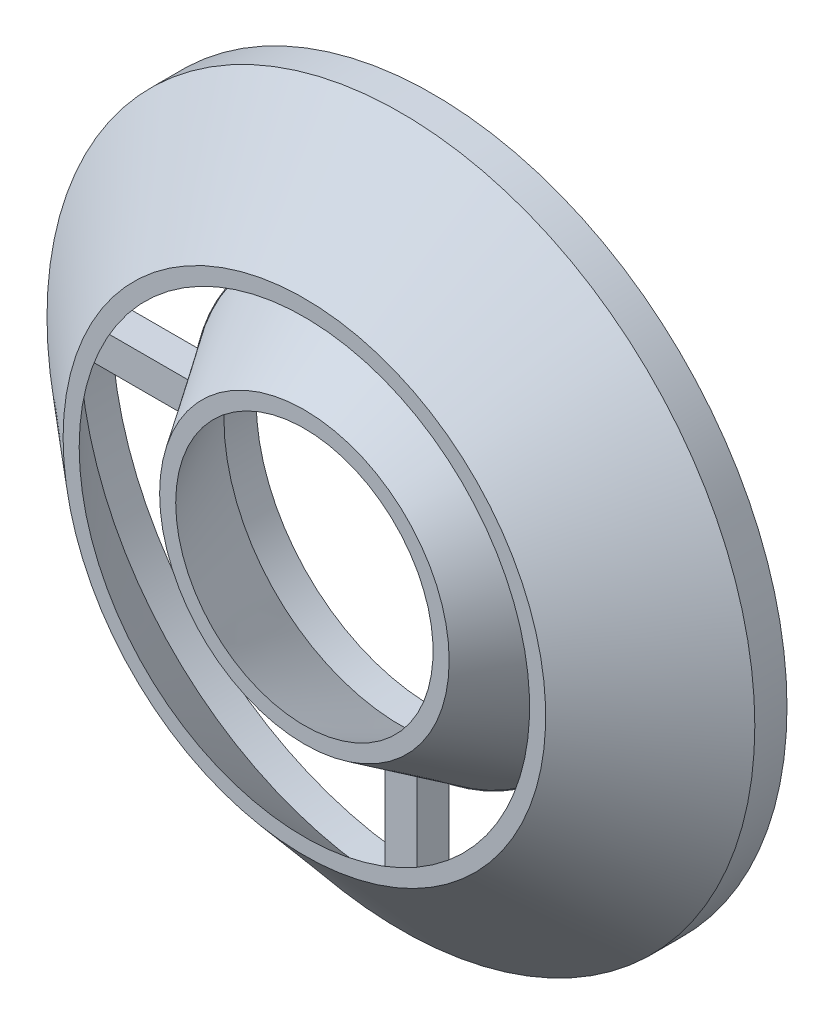
ISO-10303-21;
HEADER;
FILE_DESCRIPTION(('STEP AP214'),'2;1');
FILE_NAME('part.step','',(''),(''),'','','');
FILE_SCHEMA(('AUTOMOTIVE_DESIGN { 1 0 10303 214 1 1 1 1 }'));
ENDSEC;
DATA;
#1=APPLICATION_CONTEXT('core data for automotive mechanical design processes');
#2=APPLICATION_PROTOCOL_DEFINITION('international standard','automotive_design',2000,#1);
#3=PRODUCT_CONTEXT('',#1,'mechanical');
#4=PRODUCT('Part','Part','',(#3));
#5=PRODUCT_RELATED_PRODUCT_CATEGORY('part','',(#4));
#6=PRODUCT_DEFINITION_FORMATION('','',#4);
#7=PRODUCT_DEFINITION_CONTEXT('part definition',#1,'design');
#8=PRODUCT_DEFINITION('design','',#6,#7);
#9=PRODUCT_DEFINITION_SHAPE('','',#8);
#10=(LENGTH_UNIT() NAMED_UNIT(*) SI_UNIT(.MILLI.,.METRE.));
#11=(NAMED_UNIT(*) PLANE_ANGLE_UNIT() SI_UNIT($,.RADIAN.));
#12=(NAMED_UNIT(*) SI_UNIT($,.STERADIAN.) SOLID_ANGLE_UNIT());
#13=UNCERTAINTY_MEASURE_WITH_UNIT(LENGTH_MEASURE(1.E-05),#10,'distance_accuracy_value','');
#14=(GEOMETRIC_REPRESENTATION_CONTEXT(3) GLOBAL_UNCERTAINTY_ASSIGNED_CONTEXT((#13)) GLOBAL_UNIT_ASSIGNED_CONTEXT((#10,
#11,#12)) REPRESENTATION_CONTEXT('',''));
#15=CARTESIAN_POINT('',(0.,0.,0.));
#16=DIRECTION('',(0.,0.,1.));
#17=DIRECTION('',(1.,0.,0.));
#18=AXIS2_PLACEMENT_3D('',#15,#16,#17);
#19=CARTESIAN_POINT('',(0.,-48.5414213562373,2.));
#20=DIRECTION('',(0.,0.,1.));
#21=DIRECTION('',(1.,0.,0.));
#22=AXIS2_PLACEMENT_3D('',#19,#20,#21);
#23=PLANE('',#22);
#24=CARTESIAN_POINT('',(0.,0.,2.));
#25=DIRECTION('',(0.,0.,-1.));
#26=DIRECTION('',(-1.,0.,0.));
#27=AXIS2_PLACEMENT_3D('',#24,#25,#26);
#28=CIRCLE('',#27,12.9614813968157);
#29=CARTESIAN_POINT('',(-12.9614813968157,0.,2.));
#30=VERTEX_POINT('',#29);
#31=EDGE_CURVE('E223',#30,#30,#28,.T.);
#32=ORIENTED_EDGE('',*,*,#31,.T.);
#33=EDGE_LOOP('',(#32));
#34=FACE_BOUND('',#33,.T.);
#35=DIRECTION('',(0.,-1.,0.));
#36=VECTOR('',#35,1.);
#37=CARTESIAN_POINT('',(1.,-48.5414213562373,2.));
#38=LINE('',#37,#36);
#39=CARTESIAN_POINT('',(1.,19.94993734326,2.));
#40=VERTEX_POINT('',#39);
#41=CARTESIAN_POINT('',(1.,12.9614813968157,2.));
#42=VERTEX_POINT('',#41);
#43=EDGE_CURVE('E60',#40,#42,#38,.T.);
#44=ORIENTED_EDGE('',*,*,#43,.F.);
#45=CARTESIAN_POINT('',(0.,0.,2.));
#46=DIRECTION('',(0.,0.,-1.));
#47=DIRECTION('',(-1.,0.,0.));
#48=AXIS2_PLACEMENT_3D('',#45,#46,#47);
#49=CIRCLE('',#48,19.9749843554382);
#50=CARTESIAN_POINT('',(-1.,19.94993734326,2.));
#51=VERTEX_POINT('',#50);
#52=EDGE_CURVE('E346',#51,#40,#49,.T.);
#53=ORIENTED_EDGE('',*,*,#52,.F.);
#54=DIRECTION('',(0.,-1.,0.));
#55=VECTOR('',#54,1.);
#56=CARTESIAN_POINT('',(-1.,-48.5414213562373,2.));
#57=LINE('',#56,#55);
#58=CARTESIAN_POINT('',(-1.,12.9614813968157,2.));
#59=VERTEX_POINT('',#58);
#60=EDGE_CURVE('E163',#51,#59,#57,.T.);
#61=ORIENTED_EDGE('',*,*,#60,.T.);
#62=CARTESIAN_POINT('',(0.,0.,2.));
#63=DIRECTION('',(0.,0.,1.));
#64=DIRECTION('',(1.,0.,0.));
#65=AXIS2_PLACEMENT_3D('',#62,#63,#64);
#66=CIRCLE('',#65,13.);
#67=CARTESIAN_POINT('',(-12.9614813968157,1.00000000000014,2.));
#68=VERTEX_POINT('',#67);
#69=EDGE_CURVE('E158',#59,#68,#66,.T.);
#70=ORIENTED_EDGE('',*,*,#69,.T.);
#71=DIRECTION('',(1.,0.,0.));
#72=VECTOR('',#71,1.);
#73=CARTESIAN_POINT('',(5.24621151064259E-13,1.,2.));
#74=LINE('',#73,#72);
#75=CARTESIAN_POINT('',(-19.94993734326,1.00000000000021,2.));
#76=VERTEX_POINT('',#75);
#77=EDGE_CURVE('E146',#76,#68,#74,.T.);
#78=ORIENTED_EDGE('',*,*,#77,.F.);
#79=CARTESIAN_POINT('',(-19.94993734326,-0.999999999999792,2.));
#80=VERTEX_POINT('',#79);
#81=EDGE_CURVE('E332',#80,#76,#49,.T.);
#82=ORIENTED_EDGE('',*,*,#81,.F.);
#83=DIRECTION('',(1.,0.,0.));
#84=VECTOR('',#83,1.);
#85=CARTESIAN_POINT('',(5.03659041907623E-13,-1.,2.));
#86=LINE('',#85,#84);
#87=CARTESIAN_POINT('',(-12.9614813968157,-0.999999999999865,2.));
#88=VERTEX_POINT('',#87);
#89=EDGE_CURVE('E370',#80,#88,#86,.T.);
#90=ORIENTED_EDGE('',*,*,#89,.T.);
#91=CARTESIAN_POINT('',(-1.00000000000009,-12.9614813968157,2.));
#92=VERTEX_POINT('',#91);
#93=EDGE_CURVE('E169',#88,#92,#66,.T.);
#94=ORIENTED_EDGE('',*,*,#93,.T.);
#95=DIRECTION('',(0.,1.,0.));
#96=VECTOR('',#95,1.);
#97=CARTESIAN_POINT('',(-1.00000000000034,-48.5414213562373,2.));
#98=LINE('',#97,#96);
#99=CARTESIAN_POINT('',(-1.00000000000014,-19.94993734326,2.));
#100=VERTEX_POINT('',#99);
#101=EDGE_CURVE('E375',#100,#92,#98,.T.);
#102=ORIENTED_EDGE('',*,*,#101,.F.);
#103=CARTESIAN_POINT('',(0.999999999999861,-19.94993734326,2.));
#104=VERTEX_POINT('',#103);
#105=EDGE_CURVE('E403',#104,#100,#49,.T.);
#106=ORIENTED_EDGE('',*,*,#105,.F.);
#107=DIRECTION('',(0.,1.,0.));
#108=VECTOR('',#107,1.);
#109=CARTESIAN_POINT('',(0.999999999999661,-48.5414213562373,2.));
#110=LINE('',#109,#108);
#111=CARTESIAN_POINT('',(0.99999999999991,-12.9614813968157,2.));
#112=VERTEX_POINT('',#111);
#113=EDGE_CURVE('E127',#104,#112,#110,.T.);
#114=ORIENTED_EDGE('',*,*,#113,.T.);
#115=CARTESIAN_POINT('',(12.9614813968157,-1.00000000000005,2.));
#116=VERTEX_POINT('',#115);
#117=EDGE_CURVE('E362',#112,#116,#66,.T.);
#118=ORIENTED_EDGE('',*,*,#117,.T.);
#119=DIRECTION('',(-1.,0.,0.));
#120=VECTOR('',#119,1.);
#121=CARTESIAN_POINT('',(1.71469553930597E-13,-1.,2.));
#122=LINE('',#121,#120);
#123=CARTESIAN_POINT('',(19.94993734326,-1.00000000000007,2.));
#124=VERTEX_POINT('',#123);
#125=EDGE_CURVE('E364',#124,#116,#122,.T.);
#126=ORIENTED_EDGE('',*,*,#125,.F.);
#127=CARTESIAN_POINT('',(19.94993734326,0.999999999999931,2.));
#128=VERTEX_POINT('',#127);
#129=EDGE_CURVE('E51',#128,#124,#49,.T.);
#130=ORIENTED_EDGE('',*,*,#129,.F.);
#131=DIRECTION('',(-1.,0.,0.));
#132=VECTOR('',#131,1.);
#133=CARTESIAN_POINT('',(1.78456923649476E-13,1.,2.));
#134=LINE('',#133,#132);
#135=CARTESIAN_POINT('',(12.9614813968157,0.999999999999956,2.));
#136=VERTEX_POINT('',#135);
#137=EDGE_CURVE('E377',#128,#136,#134,.T.);
#138=ORIENTED_EDGE('',*,*,#137,.T.);
#139=EDGE_CURVE('E170',#136,#42,#66,.T.);
#140=ORIENTED_EDGE('',*,*,#139,.T.);
#141=EDGE_LOOP('',(#44,#53,#61,#70,#78,#82,#90,#94,#102,#106,#114,#118,#126,#130,#138,#140));
#142=FACE_BOUND('',#141,.T.);
#143=ADVANCED_FACE('F34',(#34,#142),#23,.T.);
#144=CARTESIAN_POINT('',(1.78456923649476E-13,1.,2.));
#145=DIRECTION('',(0.,-1.,0.));
#146=DIRECTION('',(1.,0.,0.));
#147=AXIS2_PLACEMENT_3D('',#144,#145,#146);
#148=PLANE('',#147);
#149=DIRECTION('',(-1.,0.,0.));
#150=VECTOR('',#149,1.);
#151=CARTESIAN_POINT('',(1.78456923649476E-13,1.,0.));
#152=LINE('',#151,#150);
#153=CARTESIAN_POINT('',(19.9749843554382,0.999999999999931,0.));
#154=VERTEX_POINT('',#153);
#155=CARTESIAN_POINT('',(12.9614813968157,0.999999999999956,0.));
#156=VERTEX_POINT('',#155);
#157=EDGE_CURVE('E260',#154,#156,#152,.T.);
#158=ORIENTED_EDGE('',*,*,#157,.T.);
#159=DIRECTION('',(0.,0.,-1.));
#160=VECTOR('',#159,1.);
#161=CARTESIAN_POINT('',(12.9614813968157,0.999999999999956,2.));
#162=LINE('',#161,#160);
#163=EDGE_CURVE('E11',#136,#156,#162,.T.);
#164=ORIENTED_EDGE('',*,*,#163,.F.);
#165=ORIENTED_EDGE('',*,*,#137,.F.);
#166=CARTESIAN_POINT('',(19.9749843554382,0.999999999999931,2.));
#167=VERTEX_POINT('',#166);
#168=EDGE_CURVE('E378',#167,#128,#134,.T.);
#169=ORIENTED_EDGE('',*,*,#168,.F.);
#170=DIRECTION('',(0.,0.,-1.));
#171=VECTOR('',#170,1.);
#172=CARTESIAN_POINT('',(19.9749843554382,0.999999999999931,2.));
#173=LINE('',#172,#171);
#174=EDGE_CURVE('E118',#167,#154,#173,.T.);
#175=ORIENTED_EDGE('',*,*,#174,.T.);
#176=EDGE_LOOP('',(#158,#164,#165,#169,#175));
#177=FACE_BOUND('',#176,.T.);
#178=ADVANCED_FACE('F414',(#177),#148,.F.);
#179=CARTESIAN_POINT('',(0.,0.,2.));
#180=DIRECTION('',(0.,0.,-1.));
#181=DIRECTION('',(-1.,0.,0.));
#182=AXIS2_PLACEMENT_3D('',#179,#180,#181);
#183=CYLINDRICAL_SURFACE('',#182,13.);
#184=CARTESIAN_POINT('',(0.,0.,0.));
#185=DIRECTION('',(0.,0.,1.));
#186=DIRECTION('',(1.,0.,0.));
#187=AXIS2_PLACEMENT_3D('',#184,#185,#186);
#188=CIRCLE('',#187,13.);
#189=CARTESIAN_POINT('',(1.,12.9614813968157,0.));
#190=VERTEX_POINT('',#189);
#191=EDGE_CURVE('E262',#156,#190,#188,.T.);
#192=ORIENTED_EDGE('',*,*,#191,.T.);
#193=DIRECTION('',(0.,0.,-1.));
#194=VECTOR('',#193,1.);
#195=CARTESIAN_POINT('',(1.,12.9614813968157,2.));
#196=LINE('',#195,#194);
#197=EDGE_CURVE('E43',#42,#190,#196,.T.);
#198=ORIENTED_EDGE('',*,*,#197,.F.);
#199=ORIENTED_EDGE('',*,*,#139,.F.);
#200=ORIENTED_EDGE('',*,*,#163,.T.);
#201=EDGE_LOOP('',(#192,#198,#199,#200));
#202=FACE_BOUND('',#201,.T.);
#203=ADVANCED_FACE('F281',(#202),#183,.T.);
#204=CARTESIAN_POINT('',(1.,-48.5414213562373,2.));
#205=DIRECTION('',(1.,0.,0.));
#206=DIRECTION('',(0.,0.,-1.));
#207=AXIS2_PLACEMENT_3D('',#204,#205,#206);
#208=PLANE('',#207);
#209=DIRECTION('',(0.,-1.,0.));
#210=VECTOR('',#209,1.);
#211=CARTESIAN_POINT('',(1.,-48.5414213562373,0.));
#212=LINE('',#211,#210);
#213=CARTESIAN_POINT('',(1.,19.9749843554382,0.));
#214=VERTEX_POINT('',#213);
#215=EDGE_CURVE('E233',#214,#190,#212,.T.);
#216=ORIENTED_EDGE('',*,*,#215,.F.);
#217=DIRECTION('',(0.,0.,-1.));
#218=VECTOR('',#217,1.);
#219=CARTESIAN_POINT('',(1.,19.9749843554382,2.));
#220=LINE('',#219,#218);
#221=CARTESIAN_POINT('',(1.,19.9749843554382,2.));
#222=VERTEX_POINT('',#221);
#223=EDGE_CURVE('E272',#222,#214,#220,.T.);
#224=ORIENTED_EDGE('',*,*,#223,.F.);
#225=EDGE_CURVE('E294',#222,#40,#38,.T.);
#226=ORIENTED_EDGE('',*,*,#225,.T.);
#227=ORIENTED_EDGE('',*,*,#43,.T.);
#228=ORIENTED_EDGE('',*,*,#197,.T.);
#229=EDGE_LOOP('',(#216,#224,#226,#227,#228));
#230=FACE_BOUND('',#229,.T.);
#231=ADVANCED_FACE('F277',(#230),#208,.T.);
#232=CARTESIAN_POINT('',(0.,0.,2.));
#233=DIRECTION('',(0.,0.,-1.));
#234=DIRECTION('',(-1.,0.,0.));
#235=AXIS2_PLACEMENT_3D('',#232,#233,#234);
#236=CYLINDRICAL_SURFACE('',#235,20.);
#237=CARTESIAN_POINT('',(0.,0.,0.));
#238=DIRECTION('',(0.,0.,1.));
#239=DIRECTION('',(1.,0.,0.));
#240=AXIS2_PLACEMENT_3D('',#237,#238,#239);
#241=CIRCLE('',#240,20.);
#242=CARTESIAN_POINT('',(-1.,19.9749843554382,0.));
#243=VERTEX_POINT('',#242);
#244=CARTESIAN_POINT('',(-19.9749843554382,1.00000000000021,0.));
#245=VERTEX_POINT('',#244);
#246=EDGE_CURVE('E234',#243,#245,#241,.T.);
#247=ORIENTED_EDGE('',*,*,#246,.F.);
#248=DIRECTION('',(0.,0.,-1.));
#249=VECTOR('',#248,1.);
#250=CARTESIAN_POINT('',(-1.,19.9749843554382,2.));
#251=LINE('',#250,#249);
#252=CARTESIAN_POINT('',(-1.,19.9749843554382,2.));
#253=VERTEX_POINT('',#252);
#254=EDGE_CURVE('E177',#253,#243,#251,.T.);
#255=ORIENTED_EDGE('',*,*,#254,.F.);
#256=CARTESIAN_POINT('',(0.,0.,2.));
#257=DIRECTION('',(0.,0.,1.));
#258=DIRECTION('',(1.,0.,0.));
#259=AXIS2_PLACEMENT_3D('',#256,#257,#258);
#260=CIRCLE('',#259,20.);
#261=CARTESIAN_POINT('',(-19.9749843554382,1.00000000000021,2.));
#262=VERTEX_POINT('',#261);
#263=EDGE_CURVE('E374',#253,#262,#260,.T.);
#264=ORIENTED_EDGE('',*,*,#263,.T.);
#265=DIRECTION('',(0.,0.,-1.));
#266=VECTOR('',#265,1.);
#267=CARTESIAN_POINT('',(-19.9749843554382,1.00000000000021,2.));
#268=LINE('',#267,#266);
#269=EDGE_CURVE('E175',#262,#245,#268,.T.);
#270=ORIENTED_EDGE('',*,*,#269,.T.);
#271=EDGE_LOOP('',(#247,#255,#264,#270));
#272=FACE_BOUND('',#271,.T.);
#273=ADVANCED_FACE('F417',(#272),#236,.F.);
#274=CARTESIAN_POINT('',(-1.,-48.5414213562373,2.));
#275=DIRECTION('',(1.,0.,0.));
#276=DIRECTION('',(0.,0.,-1.));
#277=AXIS2_PLACEMENT_3D('',#274,#275,#276);
#278=PLANE('',#277);
#279=DIRECTION('',(0.,-1.,0.));
#280=VECTOR('',#279,1.);
#281=CARTESIAN_POINT('',(-1.,-48.5414213562373,0.));
#282=LINE('',#281,#280);
#283=CARTESIAN_POINT('',(-1.,12.9614813968157,0.));
#284=VERTEX_POINT('',#283);
#285=EDGE_CURVE('E247',#243,#284,#282,.T.);
#286=ORIENTED_EDGE('',*,*,#285,.T.);
#287=DIRECTION('',(0.,0.,-1.));
#288=VECTOR('',#287,1.);
#289=CARTESIAN_POINT('',(-1.,12.9614813968157,2.));
#290=LINE('',#289,#288);
#291=EDGE_CURVE('E174',#59,#284,#290,.T.);
#292=ORIENTED_EDGE('',*,*,#291,.F.);
#293=ORIENTED_EDGE('',*,*,#60,.F.);
#294=EDGE_CURVE('E167',#253,#51,#57,.T.);
#295=ORIENTED_EDGE('',*,*,#294,.F.);
#296=ORIENTED_EDGE('',*,*,#254,.T.);
#297=EDGE_LOOP('',(#286,#292,#293,#295,#296));
#298=FACE_BOUND('',#297,.T.);
#299=ADVANCED_FACE('F416',(#298),#278,.F.);
#300=CARTESIAN_POINT('',(-12.9614813968157,1.00000000000014,0.));
#301=VERTEX_POINT('',#300);
#302=EDGE_CURVE('E172',#284,#301,#188,.T.);
#303=ORIENTED_EDGE('',*,*,#302,.T.);
#304=DIRECTION('',(0.,0.,-1.));
#305=VECTOR('',#304,1.);
#306=CARTESIAN_POINT('',(-12.9614813968157,1.00000000000014,2.));
#307=LINE('',#306,#305);
#308=EDGE_CURVE('E151',#68,#301,#307,.T.);
#309=ORIENTED_EDGE('',*,*,#308,.F.);
#310=ORIENTED_EDGE('',*,*,#69,.F.);
#311=ORIENTED_EDGE('',*,*,#291,.T.);
#312=EDGE_LOOP('',(#303,#309,#310,#311));
#313=FACE_BOUND('',#312,.T.);
#314=ADVANCED_FACE('F171',(#313),#183,.T.);
#315=CARTESIAN_POINT('',(-19.9749843554382,-0.999999999999791,0.));
#316=VERTEX_POINT('',#315);
#317=CARTESIAN_POINT('',(-1.00000000000014,-19.9749843554382,0.));
#318=VERTEX_POINT('',#317);
#319=EDGE_CURVE('E226',#316,#318,#241,.T.);
#320=ORIENTED_EDGE('',*,*,#319,.F.);
#321=DIRECTION('',(0.,0.,-1.));
#322=VECTOR('',#321,1.);
#323=CARTESIAN_POINT('',(-19.9749843554382,-0.999999999999791,2.));
#324=LINE('',#323,#322);
#325=CARTESIAN_POINT('',(-19.9749843554382,-0.999999999999791,2.));
#326=VERTEX_POINT('',#325);
#327=EDGE_CURVE('E179',#326,#316,#324,.T.);
#328=ORIENTED_EDGE('',*,*,#327,.F.);
#329=CARTESIAN_POINT('',(-1.00000000000014,-19.9749843554382,2.));
#330=VERTEX_POINT('',#329);
#331=EDGE_CURVE('E361',#326,#330,#260,.T.);
#332=ORIENTED_EDGE('',*,*,#331,.T.);
#333=DIRECTION('',(0.,0.,-1.));
#334=VECTOR('',#333,1.);
#335=CARTESIAN_POINT('',(-1.00000000000014,-19.9749843554382,2.));
#336=LINE('',#335,#334);
#337=EDGE_CURVE('E183',#330,#318,#336,.T.);
#338=ORIENTED_EDGE('',*,*,#337,.T.);
#339=EDGE_LOOP('',(#320,#328,#332,#338));
#340=FACE_BOUND('',#339,.T.);
#341=ADVANCED_FACE('F399',(#340),#236,.F.);
#342=CARTESIAN_POINT('',(5.03659041907623E-13,-1.,2.));
#343=DIRECTION('',(0.,1.,0.));
#344=DIRECTION('',(-1.,0.,0.));
#345=AXIS2_PLACEMENT_3D('',#342,#343,#344);
#346=PLANE('',#345);
#347=DIRECTION('',(1.,0.,0.));
#348=VECTOR('',#347,1.);
#349=CARTESIAN_POINT('',(5.03659041907623E-13,-1.,0.));
#350=LINE('',#349,#348);
#351=CARTESIAN_POINT('',(-12.9614813968157,-0.999999999999865,0.));
#352=VERTEX_POINT('',#351);
#353=EDGE_CURVE('E236',#316,#352,#350,.T.);
#354=ORIENTED_EDGE('',*,*,#353,.T.);
#355=DIRECTION('',(0.,0.,-1.));
#356=VECTOR('',#355,1.);
#357=CARTESIAN_POINT('',(-12.9614813968157,-0.999999999999865,2.));
#358=LINE('',#357,#356);
#359=EDGE_CURVE('E187',#88,#352,#358,.T.);
#360=ORIENTED_EDGE('',*,*,#359,.F.);
#361=ORIENTED_EDGE('',*,*,#89,.F.);
#362=EDGE_CURVE('E368',#326,#80,#86,.T.);
#363=ORIENTED_EDGE('',*,*,#362,.F.);
#364=ORIENTED_EDGE('',*,*,#327,.T.);
#365=EDGE_LOOP('',(#354,#360,#361,#363,#364));
#366=FACE_BOUND('',#365,.T.);
#367=ADVANCED_FACE('F398',(#366),#346,.F.);
#368=CARTESIAN_POINT('',(-1.00000000000009,-12.9614813968157,0.));
#369=VERTEX_POINT('',#368);
#370=EDGE_CURVE('E243',#352,#369,#188,.T.);
#371=ORIENTED_EDGE('',*,*,#370,.T.);
#372=DIRECTION('',(0.,0.,-1.));
#373=VECTOR('',#372,1.);
#374=CARTESIAN_POINT('',(-1.00000000000009,-12.9614813968157,2.));
#375=LINE('',#374,#373);
#376=EDGE_CURVE('E185',#92,#369,#375,.T.);
#377=ORIENTED_EDGE('',*,*,#376,.F.);
#378=ORIENTED_EDGE('',*,*,#93,.F.);
#379=ORIENTED_EDGE('',*,*,#359,.T.);
#380=EDGE_LOOP('',(#371,#377,#378,#379));
#381=FACE_BOUND('',#380,.T.);
#382=ADVANCED_FACE('F397',(#381),#183,.T.);
#383=CARTESIAN_POINT('',(0.999999999999861,-19.9749843554382,0.));
#384=VERTEX_POINT('',#383);
#385=CARTESIAN_POINT('',(19.9749843554382,-1.00000000000007,0.));
#386=VERTEX_POINT('',#385);
#387=EDGE_CURVE('E217',#384,#386,#241,.T.);
#388=ORIENTED_EDGE('',*,*,#387,.F.);
#389=DIRECTION('',(0.,0.,-1.));
#390=VECTOR('',#389,1.);
#391=CARTESIAN_POINT('',(0.999999999999861,-19.9749843554382,2.));
#392=LINE('',#391,#390);
#393=CARTESIAN_POINT('',(0.999999999999861,-19.9749843554382,2.));
#394=VERTEX_POINT('',#393);
#395=EDGE_CURVE('E38',#394,#384,#392,.T.);
#396=ORIENTED_EDGE('',*,*,#395,.F.);
#397=CARTESIAN_POINT('',(19.9749843554382,-1.00000000000007,2.));
#398=VERTEX_POINT('',#397);
#399=EDGE_CURVE('E270',#394,#398,#260,.T.);
#400=ORIENTED_EDGE('',*,*,#399,.T.);
#401=DIRECTION('',(0.,0.,-1.));
#402=VECTOR('',#401,1.);
#403=CARTESIAN_POINT('',(19.9749843554382,-1.00000000000007,2.));
#404=LINE('',#403,#402);
#405=EDGE_CURVE('E191',#398,#386,#404,.T.);
#406=ORIENTED_EDGE('',*,*,#405,.T.);
#407=EDGE_LOOP('',(#388,#396,#400,#406));
#408=FACE_BOUND('',#407,.T.);
#409=ADVANCED_FACE('F221',(#408),#236,.F.);
#410=CARTESIAN_POINT('',(0.999999999999661,-48.5414213562373,2.));
#411=DIRECTION('',(-1.,0.,0.));
#412=DIRECTION('',(0.,-1.,0.));
#413=AXIS2_PLACEMENT_3D('',#410,#411,#412);
#414=PLANE('',#413);
#415=DIRECTION('',(0.,1.,0.));
#416=VECTOR('',#415,1.);
#417=CARTESIAN_POINT('',(0.999999999999661,-48.5414213562373,0.));
#418=LINE('',#417,#416);
#419=CARTESIAN_POINT('',(0.99999999999991,-12.9614813968157,0.));
#420=VERTEX_POINT('',#419);
#421=EDGE_CURVE('E205',#384,#420,#418,.T.);
#422=ORIENTED_EDGE('',*,*,#421,.T.);
#423=DIRECTION('',(0.,0.,-1.));
#424=VECTOR('',#423,1.);
#425=CARTESIAN_POINT('',(0.99999999999991,-12.9614813968157,2.));
#426=LINE('',#425,#424);
#427=EDGE_CURVE('E195',#112,#420,#426,.T.);
#428=ORIENTED_EDGE('',*,*,#427,.F.);
#429=ORIENTED_EDGE('',*,*,#113,.F.);
#430=EDGE_CURVE('E208',#394,#104,#110,.T.);
#431=ORIENTED_EDGE('',*,*,#430,.F.);
#432=ORIENTED_EDGE('',*,*,#395,.T.);
#433=EDGE_LOOP('',(#422,#428,#429,#431,#432));
#434=FACE_BOUND('',#433,.T.);
#435=ADVANCED_FACE('F36',(#434),#414,.F.);
#436=CARTESIAN_POINT('',(12.9614813968157,-1.00000000000005,0.));
#437=VERTEX_POINT('',#436);
#438=EDGE_CURVE('E219',#420,#437,#188,.T.);
#439=ORIENTED_EDGE('',*,*,#438,.T.);
#440=DIRECTION('',(0.,0.,-1.));
#441=VECTOR('',#440,1.);
#442=CARTESIAN_POINT('',(12.9614813968157,-1.00000000000005,2.));
#443=LINE('',#442,#441);
#444=EDGE_CURVE('E193',#116,#437,#443,.T.);
#445=ORIENTED_EDGE('',*,*,#444,.F.);
#446=ORIENTED_EDGE('',*,*,#117,.F.);
#447=ORIENTED_EDGE('',*,*,#427,.T.);
#448=EDGE_LOOP('',(#439,#445,#446,#447));
#449=FACE_BOUND('',#448,.T.);
#450=ADVANCED_FACE('F406',(#449),#183,.T.);
#451=CARTESIAN_POINT('',(0.,0.,2.));
#452=DIRECTION('',(0.,0.,-1.));
#453=DIRECTION('',(-1.,0.,0.));
#454=AXIS2_PLACEMENT_3D('',#451,#452,#453);
#455=CYLINDRICAL_SURFACE('',#454,11.);
#456=CARTESIAN_POINT('',(0.,0.,2.));
#457=DIRECTION('',(0.,0.,-1.));
#458=DIRECTION('',(-1.,0.,0.));
#459=AXIS2_PLACEMENT_3D('',#456,#457,#458);
#460=CIRCLE('',#459,11.);
#461=CARTESIAN_POINT('',(-11.,0.,2.));
#462=VERTEX_POINT('',#461);
#463=EDGE_CURVE('E348',#462,#462,#460,.T.);
#464=ORIENTED_EDGE('',*,*,#463,.F.);
#465=EDGE_LOOP('',(#464));
#466=FACE_BOUND('',#465,.T.);
#467=CARTESIAN_POINT('',(0.,0.,0.));
#468=DIRECTION('',(0.,0.,1.));
#469=DIRECTION('',(1.,0.,0.));
#470=AXIS2_PLACEMENT_3D('',#467,#468,#469);
#471=CIRCLE('',#470,11.);
#472=CARTESIAN_POINT('',(11.,0.,0.));
#473=VERTEX_POINT('',#472);
#474=EDGE_CURVE('E232',#473,#473,#471,.T.);
#475=ORIENTED_EDGE('',*,*,#474,.F.);
#476=EDGE_LOOP('',(#475));
#477=FACE_BOUND('',#476,.T.);
#478=ADVANCED_FACE('F428',(#466,#477),#455,.F.);
#479=EDGE_CURVE('E225',#154,#214,#241,.T.);
#480=ORIENTED_EDGE('',*,*,#479,.F.);
#481=ORIENTED_EDGE('',*,*,#174,.F.);
#482=EDGE_CURVE('E291',#167,#222,#260,.T.);
#483=ORIENTED_EDGE('',*,*,#482,.T.);
#484=ORIENTED_EDGE('',*,*,#223,.T.);
#485=EDGE_LOOP('',(#480,#481,#483,#484));
#486=FACE_BOUND('',#485,.T.);
#487=ADVANCED_FACE('F287',(#486),#236,.F.);
#488=CARTESIAN_POINT('',(5.24621151064259E-13,1.,2.));
#489=DIRECTION('',(0.,1.,0.));
#490=DIRECTION('',(-1.,0.,0.));
#491=AXIS2_PLACEMENT_3D('',#488,#489,#490);
#492=PLANE('',#491);
#493=DIRECTION('',(1.,0.,0.));
#494=VECTOR('',#493,1.);
#495=CARTESIAN_POINT('',(5.24621151064259E-13,1.,0.));
#496=LINE('',#495,#494);
#497=EDGE_CURVE('E258',#245,#301,#496,.T.);
#498=ORIENTED_EDGE('',*,*,#497,.F.);
#499=ORIENTED_EDGE('',*,*,#269,.F.);
#500=EDGE_CURVE('E156',#262,#76,#74,.T.);
#501=ORIENTED_EDGE('',*,*,#500,.T.);
#502=ORIENTED_EDGE('',*,*,#77,.T.);
#503=ORIENTED_EDGE('',*,*,#308,.T.);
#504=EDGE_LOOP('',(#498,#499,#501,#502,#503));
#505=FACE_BOUND('',#504,.T.);
#506=ADVANCED_FACE('F149',(#505),#492,.T.);
#507=CARTESIAN_POINT('',(-1.00000000000034,-48.5414213562373,2.));
#508=DIRECTION('',(-1.,0.,0.));
#509=DIRECTION('',(0.,-1.,0.));
#510=AXIS2_PLACEMENT_3D('',#507,#508,#509);
#511=PLANE('',#510);
#512=DIRECTION('',(0.,1.,0.));
#513=VECTOR('',#512,1.);
#514=CARTESIAN_POINT('',(-1.00000000000034,-48.5414213562373,0.));
#515=LINE('',#514,#513);
#516=EDGE_CURVE('E248',#318,#369,#515,.T.);
#517=ORIENTED_EDGE('',*,*,#516,.F.);
#518=ORIENTED_EDGE('',*,*,#337,.F.);
#519=EDGE_CURVE('E371',#330,#100,#98,.T.);
#520=ORIENTED_EDGE('',*,*,#519,.T.);
#521=ORIENTED_EDGE('',*,*,#101,.T.);
#522=ORIENTED_EDGE('',*,*,#376,.T.);
#523=EDGE_LOOP('',(#517,#518,#520,#521,#522));
#524=FACE_BOUND('',#523,.T.);
#525=ADVANCED_FACE('F402',(#524),#511,.T.);
#526=CARTESIAN_POINT('',(1.71469553930597E-13,-1.,2.));
#527=DIRECTION('',(0.,-1.,0.));
#528=DIRECTION('',(1.,0.,0.));
#529=AXIS2_PLACEMENT_3D('',#526,#527,#528);
#530=PLANE('',#529);
#531=DIRECTION('',(-1.,0.,0.));
#532=VECTOR('',#531,1.);
#533=CARTESIAN_POINT('',(1.71469553930597E-13,-1.,0.));
#534=LINE('',#533,#532);
#535=EDGE_CURVE('E237',#386,#437,#534,.T.);
#536=ORIENTED_EDGE('',*,*,#535,.F.);
#537=ORIENTED_EDGE('',*,*,#405,.F.);
#538=EDGE_CURVE('E365',#398,#124,#122,.T.);
#539=ORIENTED_EDGE('',*,*,#538,.T.);
#540=ORIENTED_EDGE('',*,*,#125,.T.);
#541=ORIENTED_EDGE('',*,*,#444,.T.);
#542=EDGE_LOOP('',(#536,#537,#539,#540,#541));
#543=FACE_BOUND('',#542,.T.);
#544=ADVANCED_FACE('F410',(#543),#530,.T.);
#545=CARTESIAN_POINT('',(0.,0.,2.));
#546=DIRECTION('',(0.,0.,-1.));
#547=DIRECTION('',(-1.,0.,0.));
#548=AXIS2_PLACEMENT_3D('',#545,#546,#547);
#549=CYLINDRICAL_SURFACE('',#548,22.);
#550=CARTESIAN_POINT('',(0.,0.,2.));
#551=DIRECTION('',(0.,0.,1.));
#552=DIRECTION('',(1.,0.,0.));
#553=AXIS2_PLACEMENT_3D('',#550,#551,#552);
#554=CIRCLE('',#553,22.);
#555=CARTESIAN_POINT('',(22.,0.,2.));
#556=VERTEX_POINT('',#555);
#557=EDGE_CURVE('E194',#556,#556,#554,.T.);
#558=ORIENTED_EDGE('',*,*,#557,.F.);
#559=EDGE_LOOP('',(#558));
#560=FACE_BOUND('',#559,.T.);
#561=CARTESIAN_POINT('',(0.,0.,0.));
#562=DIRECTION('',(0.,0.,1.));
#563=DIRECTION('',(1.,0.,0.));
#564=AXIS2_PLACEMENT_3D('',#561,#562,#563);
#565=CIRCLE('',#564,22.);
#566=CARTESIAN_POINT('',(22.,0.,0.));
#567=VERTEX_POINT('',#566);
#568=EDGE_CURVE('E267',#567,#567,#565,.T.);
#569=ORIENTED_EDGE('',*,*,#568,.T.);
#570=EDGE_LOOP('',(#569));
#571=FACE_BOUND('',#570,.T.);
#572=ADVANCED_FACE('F443',(#560,#571),#549,.T.);
#573=CARTESIAN_POINT('',(0.,-48.5414213562373,0.));
#574=DIRECTION('',(0.,0.,1.));
#575=DIRECTION('',(1.,0.,0.));
#576=AXIS2_PLACEMENT_3D('',#573,#574,#575);
#577=PLANE('',#576);
#578=ORIENTED_EDGE('',*,*,#387,.T.);
#579=ORIENTED_EDGE('',*,*,#535,.T.);
#580=ORIENTED_EDGE('',*,*,#438,.F.);
#581=ORIENTED_EDGE('',*,*,#421,.F.);
#582=EDGE_LOOP('',(#578,#579,#580,#581));
#583=FACE_BOUND('',#582,.T.);
#584=ORIENTED_EDGE('',*,*,#319,.T.);
#585=ORIENTED_EDGE('',*,*,#516,.T.);
#586=ORIENTED_EDGE('',*,*,#370,.F.);
#587=ORIENTED_EDGE('',*,*,#353,.F.);
#588=EDGE_LOOP('',(#584,#585,#586,#587));
#589=FACE_BOUND('',#588,.T.);
#590=ORIENTED_EDGE('',*,*,#246,.T.);
#591=ORIENTED_EDGE('',*,*,#497,.T.);
#592=ORIENTED_EDGE('',*,*,#302,.F.);
#593=ORIENTED_EDGE('',*,*,#285,.F.);
#594=EDGE_LOOP('',(#590,#591,#592,#593));
#595=FACE_BOUND('',#594,.T.);
#596=ORIENTED_EDGE('',*,*,#157,.F.);
#597=ORIENTED_EDGE('',*,*,#479,.T.);
#598=ORIENTED_EDGE('',*,*,#215,.T.);
#599=ORIENTED_EDGE('',*,*,#191,.F.);
#600=EDGE_LOOP('',(#596,#597,#598,#599));
#601=FACE_BOUND('',#600,.T.);
#602=ORIENTED_EDGE('',*,*,#474,.T.);
#603=EDGE_LOOP('',(#602));
#604=FACE_BOUND('',#603,.T.);
#605=ORIENTED_EDGE('',*,*,#568,.F.);
#606=EDGE_LOOP('',(#605));
#607=FACE_BOUND('',#606,.T.);
#608=ADVANCED_FACE('F214',(#583,#589,#595,#601,#604,#607),#577,.F.);
#609=CARTESIAN_POINT('',(0.,0.,8.));
#610=DIRECTION('',(0.,0.,-1.));
#611=DIRECTION('',(-1.,0.,0.));
#612=AXIS2_PLACEMENT_3D('',#609,#610,#611);
#613=CONICAL_SURFACE('',#612,9.,0.583544970942519);
#614=ORIENTED_EDGE('',*,*,#31,.F.);
#615=EDGE_LOOP('',(#614));
#616=FACE_BOUND('',#615,.T.);
#617=CARTESIAN_POINT('',(0.,0.,8.));
#618=DIRECTION('',(0.,0.,-1.));
#619=DIRECTION('',(-1.,0.,0.));
#620=AXIS2_PLACEMENT_3D('',#617,#618,#619);
#621=CIRCLE('',#620,9.);
#622=CARTESIAN_POINT('',(-9.,0.,8.));
#623=VERTEX_POINT('',#622);
#624=EDGE_CURVE('E228',#623,#623,#621,.T.);
#625=ORIENTED_EDGE('',*,*,#624,.T.);
#626=EDGE_LOOP('',(#625));
#627=FACE_BOUND('',#626,.T.);
#628=ADVANCED_FACE('F439',(#616,#627),#613,.T.);
#629=CARTESIAN_POINT('',(8.,0.,8.));
#630=DIRECTION('',(0.,0.,-1.));
#631=DIRECTION('',(-1.,0.,0.));
#632=AXIS2_PLACEMENT_3D('',#629,#630,#631);
#633=PLANE('',#632);
#634=ORIENTED_EDGE('',*,*,#624,.F.);
#635=EDGE_LOOP('',(#634));
#636=FACE_BOUND('',#635,.T.);
#637=CARTESIAN_POINT('',(0.,0.,8.));
#638=DIRECTION('',(0.,0.,-1.));
#639=DIRECTION('',(-1.,0.,0.));
#640=AXIS2_PLACEMENT_3D('',#637,#638,#639);
#641=CIRCLE('',#640,8.);
#642=CARTESIAN_POINT('',(-8.,0.,8.));
#643=VERTEX_POINT('',#642);
#644=EDGE_CURVE('E355',#643,#643,#641,.T.);
#645=ORIENTED_EDGE('',*,*,#644,.T.);
#646=EDGE_LOOP('',(#645));
#647=FACE_BOUND('',#646,.T.);
#648=ADVANCED_FACE('F461',(#636,#647),#633,.F.);
#649=CARTESIAN_POINT('',(0.,0.,2.));
#650=DIRECTION('',(0.,0.,-1.));
#651=DIRECTION('',(-1.,0.,0.));
#652=AXIS2_PLACEMENT_3D('',#649,#650,#651);
#653=CONICAL_SURFACE('',#652,11.,0.463647609000806);
#654=ORIENTED_EDGE('',*,*,#644,.F.);
#655=EDGE_LOOP('',(#654));
#656=FACE_BOUND('',#655,.T.);
#657=ORIENTED_EDGE('',*,*,#463,.T.);
#658=EDGE_LOOP('',(#657));
#659=FACE_BOUND('',#658,.T.);
#660=ADVANCED_FACE('F459',(#656,#659),#653,.F.);
#661=CARTESIAN_POINT('',(19.9749843554382,0.,2.));
#662=DIRECTION('',(0.,0.,1.));
#663=DIRECTION('',(1.,0.,0.));
#664=AXIS2_PLACEMENT_3D('',#661,#662,#663);
#665=PLANE('',#664);
#666=ORIENTED_EDGE('',*,*,#482,.F.);
#667=ORIENTED_EDGE('',*,*,#168,.T.);
#668=EDGE_CURVE('E350',#40,#128,#49,.T.);
#669=ORIENTED_EDGE('',*,*,#668,.F.);
#670=ORIENTED_EDGE('',*,*,#225,.F.);
#671=EDGE_LOOP('',(#666,#667,#669,#670));
#672=FACE_BOUND('',#671,.T.);
#673=ADVANCED_FACE('F413',(#672),#665,.F.);
#674=ORIENTED_EDGE('',*,*,#263,.F.);
#675=ORIENTED_EDGE('',*,*,#294,.T.);
#676=EDGE_CURVE('E336',#76,#51,#49,.T.);
#677=ORIENTED_EDGE('',*,*,#676,.F.);
#678=ORIENTED_EDGE('',*,*,#500,.F.);
#679=EDGE_LOOP('',(#674,#675,#677,#678));
#680=FACE_BOUND('',#679,.T.);
#681=ADVANCED_FACE('F343',(#680),#665,.F.);
#682=ORIENTED_EDGE('',*,*,#331,.F.);
#683=ORIENTED_EDGE('',*,*,#362,.T.);
#684=EDGE_CURVE('E338',#100,#80,#49,.T.);
#685=ORIENTED_EDGE('',*,*,#684,.F.);
#686=ORIENTED_EDGE('',*,*,#519,.F.);
#687=EDGE_LOOP('',(#682,#683,#685,#686));
#688=FACE_BOUND('',#687,.T.);
#689=ADVANCED_FACE('F500',(#688),#665,.F.);
#690=ORIENTED_EDGE('',*,*,#399,.F.);
#691=ORIENTED_EDGE('',*,*,#430,.T.);
#692=EDGE_CURVE('E404',#124,#104,#49,.T.);
#693=ORIENTED_EDGE('',*,*,#692,.F.);
#694=ORIENTED_EDGE('',*,*,#538,.F.);
#695=EDGE_LOOP('',(#690,#691,#693,#694));
#696=FACE_BOUND('',#695,.T.);
#697=ADVANCED_FACE('F412',(#696),#665,.F.);
#698=CARTESIAN_POINT('',(14.,0.,8.));
#699=DIRECTION('',(0.,0.,-1.));
#700=DIRECTION('',(-1.,0.,0.));
#701=AXIS2_PLACEMENT_3D('',#698,#699,#700);
#702=PLANE('',#701);
#703=CARTESIAN_POINT('',(0.,0.,8.));
#704=DIRECTION('',(0.,0.,-1.));
#705=DIRECTION('',(-1.,0.,0.));
#706=AXIS2_PLACEMENT_3D('',#703,#704,#705);
#707=CIRCLE('',#706,15.);
#708=CARTESIAN_POINT('',(-15.,0.,8.));
#709=VERTEX_POINT('',#708);
#710=EDGE_CURVE('E345',#709,#709,#707,.T.);
#711=ORIENTED_EDGE('',*,*,#710,.F.);
#712=EDGE_LOOP('',(#711));
#713=FACE_BOUND('',#712,.T.);
#714=CARTESIAN_POINT('',(0.,0.,8.));
#715=DIRECTION('',(0.,0.,-1.));
#716=DIRECTION('',(-1.,0.,0.));
#717=AXIS2_PLACEMENT_3D('',#714,#715,#716);
#718=CIRCLE('',#717,14.);
#719=CARTESIAN_POINT('',(-14.,0.,8.));
#720=VERTEX_POINT('',#719);
#721=EDGE_CURVE('E340',#720,#720,#718,.T.);
#722=ORIENTED_EDGE('',*,*,#721,.T.);
#723=EDGE_LOOP('',(#722));
#724=FACE_BOUND('',#723,.T.);
#725=ADVANCED_FACE('F472',(#713,#724),#702,.F.);
#726=CARTESIAN_POINT('',(0.,0.,8.));
#727=DIRECTION('',(0.,0.,-1.));
#728=DIRECTION('',(-1.,0.,0.));
#729=AXIS2_PLACEMENT_3D('',#726,#727,#728);
#730=CONICAL_SURFACE('',#729,15.,0.862170054667226);
#731=ORIENTED_EDGE('',*,*,#557,.T.);
#732=EDGE_LOOP('',(#731));
#733=FACE_BOUND('',#732,.T.);
#734=ORIENTED_EDGE('',*,*,#710,.T.);
#735=EDGE_LOOP('',(#734));
#736=FACE_BOUND('',#735,.T.);
#737=ADVANCED_FACE('F475',(#733,#736),#730,.T.);
#738=CARTESIAN_POINT('',(0.,0.,2.));
#739=DIRECTION('',(0.,0.,-1.));
#740=DIRECTION('',(-1.,0.,0.));
#741=AXIS2_PLACEMENT_3D('',#738,#739,#740);
#742=CONICAL_SURFACE('',#741,19.9749843554382,0.783309174599557);
#743=ORIENTED_EDGE('',*,*,#721,.F.);
#744=EDGE_LOOP('',(#743));
#745=FACE_BOUND('',#744,.T.);
#746=ORIENTED_EDGE('',*,*,#676,.T.);
#747=ORIENTED_EDGE('',*,*,#52,.T.);
#748=ORIENTED_EDGE('',*,*,#668,.T.);
#749=ORIENTED_EDGE('',*,*,#129,.T.);
#750=ORIENTED_EDGE('',*,*,#692,.T.);
#751=ORIENTED_EDGE('',*,*,#105,.T.);
#752=ORIENTED_EDGE('',*,*,#684,.T.);
#753=ORIENTED_EDGE('',*,*,#81,.T.);
#754=EDGE_LOOP('',(#746,#747,#748,#749,#750,#751,#752,#753));
#755=FACE_BOUND('',#754,.T.);
#756=ADVANCED_FACE('F334',(#745,#755),#742,.F.);
#757=CLOSED_SHELL('',(#143,#178,#203,#231,#273,#299,#314,#341,#367,#382,#409,#435,#450,#478,
#487,#506,#525,#544,#572,#608,#628,#648,#660,#673,#681,#689,#697,#725,#737,#756));
#758=MANIFOLD_SOLID_BREP('B2',#757);
#759=ADVANCED_BREP_SHAPE_REPRESENTATION('',(#18,#758),#14);
#760=SHAPE_DEFINITION_REPRESENTATION(#9,#759);
ENDSEC;
END-ISO-10303-21;
